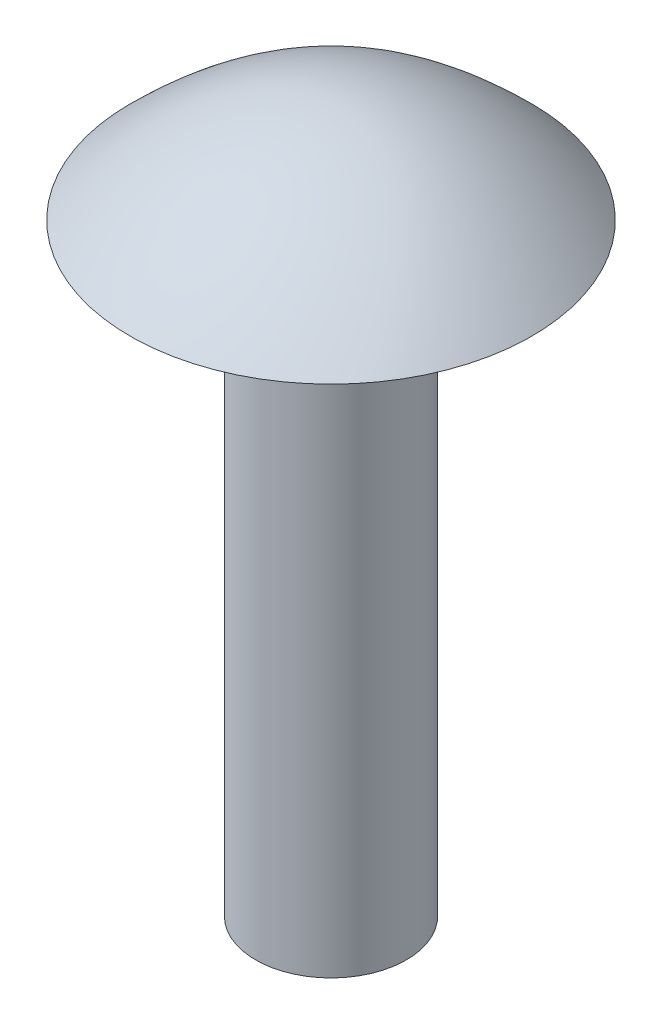
ISO-10303-21;
HEADER;
FILE_DESCRIPTION(('STEP AP214'),'2;1');
FILE_NAME('part.step','',(''),(''),'','','');
FILE_SCHEMA(('AUTOMOTIVE_DESIGN { 1 0 10303 214 1 1 1 1 }'));
ENDSEC;
DATA;
#1=APPLICATION_CONTEXT('core data for automotive mechanical design processes');
#2=APPLICATION_PROTOCOL_DEFINITION('international standard','automotive_design',2000,#1);
#3=PRODUCT_CONTEXT('',#1,'mechanical');
#4=PRODUCT('Part','Part','',(#3));
#5=PRODUCT_RELATED_PRODUCT_CATEGORY('part','',(#4));
#6=PRODUCT_DEFINITION_FORMATION('','',#4);
#7=PRODUCT_DEFINITION_CONTEXT('part definition',#1,'design');
#8=PRODUCT_DEFINITION('design','',#6,#7);
#9=PRODUCT_DEFINITION_SHAPE('','',#8);
#10=(LENGTH_UNIT() NAMED_UNIT(*) SI_UNIT(.MILLI.,.METRE.));
#11=(NAMED_UNIT(*) PLANE_ANGLE_UNIT() SI_UNIT($,.RADIAN.));
#12=(NAMED_UNIT(*) SI_UNIT($,.STERADIAN.) SOLID_ANGLE_UNIT());
#13=UNCERTAINTY_MEASURE_WITH_UNIT(LENGTH_MEASURE(1.E-05),#10,'distance_accuracy_value','');
#14=(GEOMETRIC_REPRESENTATION_CONTEXT(3) GLOBAL_UNCERTAINTY_ASSIGNED_CONTEXT((#13)) GLOBAL_UNIT_ASSIGNED_CONTEXT((#10,
#11,#12)) REPRESENTATION_CONTEXT('',''));
#15=CARTESIAN_POINT('',(0.,0.,0.));
#16=DIRECTION('',(0.,0.,1.));
#17=DIRECTION('',(1.,0.,0.));
#18=AXIS2_PLACEMENT_3D('',#15,#16,#17);
#19=CARTESIAN_POINT('',(0.,0.,0.));
#20=DIRECTION('',(0.,1.,0.));
#21=DIRECTION('',(0.,0.,1.));
#22=AXIS2_PLACEMENT_3D('',#19,#20,#21);
#23=PLANE('',#22);
#24=CARTESIAN_POINT('',(0.75,0.,0.));
#25=DIRECTION('',(0.,-1.,0.));
#26=DIRECTION('',(0.,0.,-1.));
#27=AXIS2_PLACEMENT_3D('',#24,#25,#26);
#28=CIRCLE('',#27,0.75);
#29=CARTESIAN_POINT('',(0.75,0.,-0.75));
#30=VERTEX_POINT('',#29);
#31=EDGE_CURVE('E74',#30,#30,#28,.T.);
#32=ORIENTED_EDGE('',*,*,#31,.T.);
#33=EDGE_LOOP('',(#32));
#34=FACE_BOUND('',#33,.T.);
#35=ADVANCED_FACE('F45',(#34),#23,.F.);
#36=CARTESIAN_POINT('',(0.75,7.,0.));
#37=CARTESIAN_POINT('',(-0.25,7.,0.));
#38=CARTESIAN_POINT('',(-1.25,6.,0.));
#39=B_SPLINE_CURVE_WITH_KNOTS('',2,(#36,#37,#38),.UNSPECIFIED.,.F.,.F.,(3,3),(0.,0.5),.UNSPECIFIED.);
#40=CARTESIAN_POINT('',(0.75,-1.40444363637058,0.));
#41=DIRECTION('',(0.,-1.,0.));
#42=AXIS1_PLACEMENT('',#40,#41);
#43=SURFACE_OF_REVOLUTION('',#39,#42);
#44=CARTESIAN_POINT('',(0.75,6.,0.));
#45=DIRECTION('',(0.,-1.,0.));
#46=DIRECTION('',(0.,0.,-1.));
#47=AXIS2_PLACEMENT_3D('',#44,#45,#46);
#48=CIRCLE('',#47,2.);
#49=CARTESIAN_POINT('',(0.75,6.,-2.));
#50=VERTEX_POINT('',#49);
#51=EDGE_CURVE('E11',#50,#50,#48,.T.);
#52=ORIENTED_EDGE('',*,*,#51,.F.);
#53=EDGE_LOOP('',(#52));
#54=FACE_BOUND('',#53,.T.);
#55=CARTESIAN_POINT('',(0.75,7.,0.));
#56=VERTEX_POINT('',#55);
#57=VERTEX_LOOP('',#56);
#58=FACE_BOUND('',#57,.T.);
#59=ADVANCED_FACE('F55',(#54,#58),#43,.T.);
#60=CARTESIAN_POINT('',(0.,6.,0.));
#61=DIRECTION('',(0.,1.,0.));
#62=DIRECTION('',(0.,0.,1.));
#63=AXIS2_PLACEMENT_3D('',#60,#61,#62);
#64=PLANE('',#63);
#65=CARTESIAN_POINT('',(0.75,6.,0.));
#66=DIRECTION('',(0.,-1.,0.));
#67=DIRECTION('',(0.,0.,-1.));
#68=AXIS2_PLACEMENT_3D('',#65,#66,#67);
#69=CIRCLE('',#68,0.75);
#70=CARTESIAN_POINT('',(0.75,6.,-0.75));
#71=VERTEX_POINT('',#70);
#72=EDGE_CURVE('E52',#71,#71,#69,.T.);
#73=ORIENTED_EDGE('',*,*,#72,.F.);
#74=EDGE_LOOP('',(#73));
#75=FACE_BOUND('',#74,.T.);
#76=ORIENTED_EDGE('',*,*,#51,.T.);
#77=EDGE_LOOP('',(#76));
#78=FACE_BOUND('',#77,.T.);
#79=ADVANCED_FACE('F57',(#75,#78),#64,.F.);
#80=CARTESIAN_POINT('',(0.75,-1.40444363637058,0.));
#81=DIRECTION('',(0.,-1.,0.));
#82=DIRECTION('',(0.,0.,-1.));
#83=AXIS2_PLACEMENT_3D('',#80,#81,#82);
#84=CYLINDRICAL_SURFACE('',#83,0.75);
#85=ORIENTED_EDGE('',*,*,#31,.F.);
#86=EDGE_LOOP('',(#85));
#87=FACE_BOUND('',#86,.T.);
#88=ORIENTED_EDGE('',*,*,#72,.T.);
#89=EDGE_LOOP('',(#88));
#90=FACE_BOUND('',#89,.T.);
#91=ADVANCED_FACE('F63',(#87,#90),#84,.T.);
#92=CLOSED_SHELL('',(#35,#59,#79,#91));
#93=MANIFOLD_SOLID_BREP('B2',#92);
#94=ADVANCED_BREP_SHAPE_REPRESENTATION('',(#18,#93),#14);
#95=SHAPE_DEFINITION_REPRESENTATION(#9,#94);
ENDSEC;
END-ISO-10303-21;
